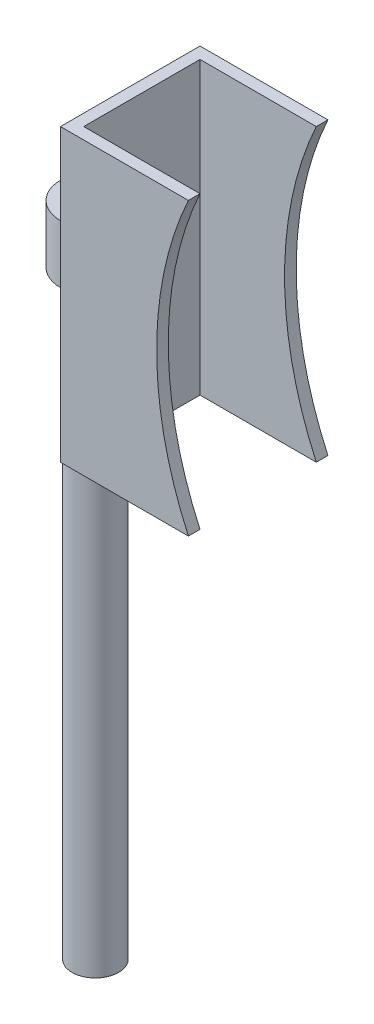
ISO-10303-21;
HEADER;
FILE_DESCRIPTION(('STEP AP214'),'2;1');
FILE_NAME('part.step','',(''),(''),'','','');
FILE_SCHEMA(('AUTOMOTIVE_DESIGN { 1 0 10303 214 1 1 1 1 }'));
ENDSEC;
DATA;
#1=APPLICATION_CONTEXT('core data for automotive mechanical design processes');
#2=APPLICATION_PROTOCOL_DEFINITION('international standard','automotive_design',2000,#1);
#3=PRODUCT_CONTEXT('',#1,'mechanical');
#4=PRODUCT('Part','Part','',(#3));
#5=PRODUCT_RELATED_PRODUCT_CATEGORY('part','',(#4));
#6=PRODUCT_DEFINITION_FORMATION('','',#4);
#7=PRODUCT_DEFINITION_CONTEXT('part definition',#1,'design');
#8=PRODUCT_DEFINITION('design','',#6,#7);
#9=PRODUCT_DEFINITION_SHAPE('','',#8);
#10=(LENGTH_UNIT() NAMED_UNIT(*) SI_UNIT(.MILLI.,.METRE.));
#11=(NAMED_UNIT(*) PLANE_ANGLE_UNIT() SI_UNIT($,.RADIAN.));
#12=(NAMED_UNIT(*) SI_UNIT($,.STERADIAN.) SOLID_ANGLE_UNIT());
#13=UNCERTAINTY_MEASURE_WITH_UNIT(LENGTH_MEASURE(1.E-05),#10,'distance_accuracy_value','');
#14=(GEOMETRIC_REPRESENTATION_CONTEXT(3) GLOBAL_UNCERTAINTY_ASSIGNED_CONTEXT((#13)) GLOBAL_UNIT_ASSIGNED_CONTEXT((#10,
#11,#12)) REPRESENTATION_CONTEXT('',''));
#15=CARTESIAN_POINT('',(0.,0.,0.));
#16=DIRECTION('',(0.,0.,1.));
#17=DIRECTION('',(1.,0.,0.));
#18=AXIS2_PLACEMENT_3D('',#15,#16,#17);
#19=CARTESIAN_POINT('',(-8.,30.,-10.));
#20=DIRECTION('',(0.,1.,0.));
#21=DIRECTION('',(0.,0.,1.));
#22=AXIS2_PLACEMENT_3D('',#19,#20,#21);
#23=PLANE('',#22);
#24=CARTESIAN_POINT('',(-8.,30.,-10.));
#25=DIRECTION('',(0.,1.,0.));
#26=DIRECTION('',(0.,0.,1.));
#27=AXIS2_PLACEMENT_3D('',#24,#25,#26);
#28=CIRCLE('',#27,6.);
#29=CARTESIAN_POINT('',(-8.,30.,-4.));
#30=VERTEX_POINT('',#29);
#31=EDGE_CURVE('E11',#30,#30,#28,.T.);
#32=ORIENTED_EDGE('',*,*,#31,.T.);
#33=EDGE_LOOP('',(#32));
#34=FACE_BOUND('',#33,.T.);
#35=CARTESIAN_POINT('',(-8.,30.,-10.));
#36=DIRECTION('',(0.,1.,0.));
#37=DIRECTION('',(0.,0.,1.));
#38=AXIS2_PLACEMENT_3D('',#35,#36,#37);
#39=CIRCLE('',#38,4.);
#40=CARTESIAN_POINT('',(-8.,30.,-6.));
#41=VERTEX_POINT('',#40);
#42=EDGE_CURVE('E52',#41,#41,#39,.T.);
#43=ORIENTED_EDGE('',*,*,#42,.F.);
#44=EDGE_LOOP('',(#43));
#45=FACE_BOUND('',#44,.T.);
#46=ADVANCED_FACE('F41',(#34,#45),#23,.T.);
#47=CARTESIAN_POINT('',(-8.,20.,-10.));
#48=DIRECTION('',(0.,1.,0.));
#49=DIRECTION('',(0.,0.,1.));
#50=AXIS2_PLACEMENT_3D('',#47,#48,#49);
#51=PLANE('',#50);
#52=CARTESIAN_POINT('',(-8.,20.,-10.));
#53=DIRECTION('',(0.,1.,0.));
#54=DIRECTION('',(0.,0.,1.));
#55=AXIS2_PLACEMENT_3D('',#52,#53,#54);
#56=CIRCLE('',#55,6.);
#57=CARTESIAN_POINT('',(-8.,20.,-4.));
#58=VERTEX_POINT('',#57);
#59=EDGE_CURVE('E45',#58,#58,#56,.T.);
#60=ORIENTED_EDGE('',*,*,#59,.F.);
#61=EDGE_LOOP('',(#60));
#62=FACE_BOUND('',#61,.T.);
#63=CARTESIAN_POINT('',(-8.,20.,-10.));
#64=DIRECTION('',(0.,1.,0.));
#65=DIRECTION('',(0.,0.,1.));
#66=AXIS2_PLACEMENT_3D('',#63,#64,#65);
#67=CIRCLE('',#66,4.);
#68=CARTESIAN_POINT('',(-8.,20.,-6.));
#69=VERTEX_POINT('',#68);
#70=EDGE_CURVE('E56',#69,#69,#67,.F.);
#71=ORIENTED_EDGE('',*,*,#70,.F.);
#72=EDGE_LOOP('',(#71));
#73=FACE_BOUND('',#72,.T.);
#74=ADVANCED_FACE('F75',(#62,#73),#51,.F.);
#75=CARTESIAN_POINT('',(-8.,30.,-10.));
#76=DIRECTION('',(0.,-1.,0.));
#77=DIRECTION('',(0.,0.,-1.));
#78=AXIS2_PLACEMENT_3D('',#75,#76,#77);
#79=CYLINDRICAL_SURFACE('',#78,6.);
#80=ORIENTED_EDGE('',*,*,#31,.F.);
#81=EDGE_LOOP('',(#80));
#82=FACE_BOUND('',#81,.T.);
#83=ORIENTED_EDGE('',*,*,#59,.T.);
#84=EDGE_LOOP('',(#83));
#85=FACE_BOUND('',#84,.T.);
#86=ADVANCED_FACE('F43',(#82,#85),#79,.T.);
#87=CARTESIAN_POINT('',(-8.,-83.,-10.));
#88=DIRECTION('',(0.,-1.,0.));
#89=DIRECTION('',(0.,0.,-1.));
#90=AXIS2_PLACEMENT_3D('',#87,#88,#89);
#91=PLANE('',#90);
#92=CARTESIAN_POINT('',(-8.,-83.,-10.));
#93=DIRECTION('',(0.,-1.,0.));
#94=DIRECTION('',(0.,0.,-1.));
#95=AXIS2_PLACEMENT_3D('',#92,#93,#94);
#96=CIRCLE('',#95,4.);
#97=CARTESIAN_POINT('',(-8.,-83.,-14.));
#98=VERTEX_POINT('',#97);
#99=EDGE_CURVE('E59',#98,#98,#96,.T.);
#100=ORIENTED_EDGE('',*,*,#99,.T.);
#101=EDGE_LOOP('',(#100));
#102=FACE_BOUND('',#101,.T.);
#103=ADVANCED_FACE('F66',(#102),#91,.T.);
#104=CARTESIAN_POINT('',(-8.,-83.,-10.));
#105=DIRECTION('',(0.,1.,0.));
#106=DIRECTION('',(0.,0.,1.));
#107=AXIS2_PLACEMENT_3D('',#104,#105,#106);
#108=CYLINDRICAL_SURFACE('',#107,4.);
#109=ORIENTED_EDGE('',*,*,#99,.F.);
#110=EDGE_LOOP('',(#109));
#111=FACE_BOUND('',#110,.T.);
#112=ORIENTED_EDGE('',*,*,#70,.T.);
#113=EDGE_LOOP('',(#112));
#114=FACE_BOUND('',#113,.T.);
#115=ADVANCED_FACE('F68',(#111,#114),#108,.T.);
#116=ORIENTED_EDGE('',*,*,#42,.T.);
#117=EDGE_LOOP('',(#116));
#118=FACE_BOUND('',#117,.T.);
#119=CARTESIAN_POINT('',(-8.,40.,-10.));
#120=DIRECTION('',(0.,-1.,0.));
#121=DIRECTION('',(0.,0.,-1.));
#122=AXIS2_PLACEMENT_3D('',#119,#120,#121);
#123=CIRCLE('',#122,4.);
#124=CARTESIAN_POINT('',(-8.,40.,-14.));
#125=VERTEX_POINT('',#124);
#126=EDGE_CURVE('E60',#125,#125,#123,.T.);
#127=ORIENTED_EDGE('',*,*,#126,.T.);
#128=EDGE_LOOP('',(#127));
#129=FACE_BOUND('',#128,.T.);
#130=ADVANCED_FACE('F71',(#118,#129),#108,.T.);
#131=CARTESIAN_POINT('',(-8.,40.,-10.));
#132=DIRECTION('',(0.,-1.,0.));
#133=DIRECTION('',(0.,0.,-1.));
#134=AXIS2_PLACEMENT_3D('',#131,#132,#133);
#135=PLANE('',#134);
#136=ORIENTED_EDGE('',*,*,#126,.F.);
#137=EDGE_LOOP('',(#136));
#138=FACE_BOUND('',#137,.T.);
#139=ADVANCED_FACE('F87',(#138),#135,.F.);
#140=CLOSED_SHELL('',(#46,#74,#86,#103,#115,#130,#139));
#141=MANIFOLD_SOLID_BREP('B2',#140);
#142=CARTESIAN_POINT('',(0.,50.,0.));
#143=DIRECTION('',(0.,0.,1.));
#144=DIRECTION('',(1.,0.,0.));
#145=AXIS2_PLACEMENT_3D('',#142,#143,#144);
#146=PLANE('',#145);
#147=DIRECTION('',(-1.,0.,0.));
#148=VECTOR('',#147,1.);
#149=CARTESIAN_POINT('',(0.,50.,0.));
#150=LINE('',#149,#148);
#151=CARTESIAN_POINT('',(20.,50.,0.));
#152=VERTEX_POINT('',#151);
#153=CARTESIAN_POINT('',(0.,50.,0.));
#154=VERTEX_POINT('',#153);
#155=EDGE_CURVE('E250',#152,#154,#150,.T.);
#156=ORIENTED_EDGE('',*,*,#155,.F.);
#157=CARTESIAN_POINT('',(74.5435605731786,25.,0.));
#158=DIRECTION('',(0.,0.,1.));
#159=DIRECTION('',(1.,0.,0.));
#160=AXIS2_PLACEMENT_3D('',#157,#158,#159);
#161=CIRCLE('',#160,60.);
#162=CARTESIAN_POINT('',(20.,0.,0.));
#163=VERTEX_POINT('',#162);
#164=EDGE_CURVE('E215',#152,#163,#161,.T.);
#165=ORIENTED_EDGE('',*,*,#164,.T.);
#166=DIRECTION('',(-1.,0.,0.));
#167=VECTOR('',#166,1.);
#168=CARTESIAN_POINT('',(0.,0.,0.));
#169=LINE('',#168,#167);
#170=CARTESIAN_POINT('',(0.,0.,0.));
#171=VERTEX_POINT('',#170);
#172=EDGE_CURVE('E234',#163,#171,#169,.T.);
#173=ORIENTED_EDGE('',*,*,#172,.T.);
#174=DIRECTION('',(0.,-1.,0.));
#175=VECTOR('',#174,1.);
#176=CARTESIAN_POINT('',(0.,50.,0.));
#177=LINE('',#176,#175);
#178=EDGE_CURVE('E39',#154,#171,#177,.T.);
#179=ORIENTED_EDGE('',*,*,#178,.F.);
#180=EDGE_LOOP('',(#156,#165,#173,#179));
#181=FACE_BOUND('',#180,.T.);
#182=ADVANCED_FACE('F140',(#181),#146,.F.);
#183=CARTESIAN_POINT('',(0.,50.,0.));
#184=DIRECTION('',(-1.,0.,0.));
#185=DIRECTION('',(0.,0.,1.));
#186=AXIS2_PLACEMENT_3D('',#183,#184,#185);
#187=PLANE('',#186);
#188=DIRECTION('',(0.,0.,-1.));
#189=VECTOR('',#188,1.);
#190=CARTESIAN_POINT('',(0.,0.,0.));
#191=LINE('',#190,#189);
#192=CARTESIAN_POINT('',(0.,0.,-20.));
#193=VERTEX_POINT('',#192);
#194=EDGE_CURVE('E237',#171,#193,#191,.T.);
#195=ORIENTED_EDGE('',*,*,#194,.T.);
#196=DIRECTION('',(0.,-1.,0.));
#197=VECTOR('',#196,1.);
#198=CARTESIAN_POINT('',(0.,50.,-20.));
#199=LINE('',#198,#197);
#200=CARTESIAN_POINT('',(0.,50.,-20.));
#201=VERTEX_POINT('',#200);
#202=EDGE_CURVE('E148',#201,#193,#199,.T.);
#203=ORIENTED_EDGE('',*,*,#202,.F.);
#204=DIRECTION('',(0.,0.,-1.));
#205=VECTOR('',#204,1.);
#206=CARTESIAN_POINT('',(0.,50.,0.));
#207=LINE('',#206,#205);
#208=EDGE_CURVE('E194',#154,#201,#207,.T.);
#209=ORIENTED_EDGE('',*,*,#208,.F.);
#210=ORIENTED_EDGE('',*,*,#178,.T.);
#211=EDGE_LOOP('',(#195,#203,#209,#210));
#212=FACE_BOUND('',#211,.T.);
#213=ADVANCED_FACE('F286',(#212),#187,.F.);
#214=CARTESIAN_POINT('',(0.,50.,-20.));
#215=DIRECTION('',(0.,0.,-1.));
#216=DIRECTION('',(-1.,0.,0.));
#217=AXIS2_PLACEMENT_3D('',#214,#215,#216);
#218=PLANE('',#217);
#219=DIRECTION('',(1.,0.,0.));
#220=VECTOR('',#219,1.);
#221=CARTESIAN_POINT('',(0.,0.,-20.));
#222=LINE('',#221,#220);
#223=CARTESIAN_POINT('',(20.,0.,-20.));
#224=VERTEX_POINT('',#223);
#225=EDGE_CURVE('E239',#193,#224,#222,.T.);
#226=ORIENTED_EDGE('',*,*,#225,.T.);
#227=CARTESIAN_POINT('',(74.5435605731786,25.,-20.));
#228=DIRECTION('',(0.,0.,-1.));
#229=DIRECTION('',(-1.,0.,0.));
#230=AXIS2_PLACEMENT_3D('',#227,#228,#229);
#231=CIRCLE('',#230,60.);
#232=CARTESIAN_POINT('',(20.,50.,-20.));
#233=VERTEX_POINT('',#232);
#234=EDGE_CURVE('E270',#224,#233,#231,.T.);
#235=ORIENTED_EDGE('',*,*,#234,.T.);
#236=DIRECTION('',(1.,0.,0.));
#237=VECTOR('',#236,1.);
#238=CARTESIAN_POINT('',(0.,50.,-20.));
#239=LINE('',#238,#237);
#240=EDGE_CURVE('E261',#201,#233,#239,.T.);
#241=ORIENTED_EDGE('',*,*,#240,.F.);
#242=ORIENTED_EDGE('',*,*,#202,.T.);
#243=EDGE_LOOP('',(#226,#235,#241,#242));
#244=FACE_BOUND('',#243,.T.);
#245=ADVANCED_FACE('F257',(#244),#218,.F.);
#246=CARTESIAN_POINT('',(-2.,50.,-22.));
#247=DIRECTION('',(0.,0.,1.));
#248=DIRECTION('',(1.,0.,0.));
#249=AXIS2_PLACEMENT_3D('',#246,#247,#248);
#250=PLANE('',#249);
#251=DIRECTION('',(-1.,0.,0.));
#252=VECTOR('',#251,1.);
#253=CARTESIAN_POINT('',(-2.,50.,-22.));
#254=LINE('',#253,#252);
#255=CARTESIAN_POINT('',(20.,50.,-22.));
#256=VERTEX_POINT('',#255);
#257=CARTESIAN_POINT('',(-2.,50.,-22.));
#258=VERTEX_POINT('',#257);
#259=EDGE_CURVE('E230',#256,#258,#254,.T.);
#260=ORIENTED_EDGE('',*,*,#259,.F.);
#261=CARTESIAN_POINT('',(74.5435605731786,25.,-22.));
#262=DIRECTION('',(0.,0.,1.));
#263=DIRECTION('',(1.,0.,0.));
#264=AXIS2_PLACEMENT_3D('',#261,#262,#263);
#265=CIRCLE('',#264,60.);
#266=CARTESIAN_POINT('',(20.,0.,-22.));
#267=VERTEX_POINT('',#266);
#268=EDGE_CURVE('E226',#256,#267,#265,.T.);
#269=ORIENTED_EDGE('',*,*,#268,.T.);
#270=DIRECTION('',(-1.,0.,0.));
#271=VECTOR('',#270,1.);
#272=CARTESIAN_POINT('',(-2.,0.,-22.));
#273=LINE('',#272,#271);
#274=CARTESIAN_POINT('',(-2.,0.,-22.));
#275=VERTEX_POINT('',#274);
#276=EDGE_CURVE('E244',#267,#275,#273,.T.);
#277=ORIENTED_EDGE('',*,*,#276,.T.);
#278=DIRECTION('',(0.,-1.,0.));
#279=VECTOR('',#278,1.);
#280=CARTESIAN_POINT('',(-2.,50.,-22.));
#281=LINE('',#280,#279);
#282=EDGE_CURVE('E252',#258,#275,#281,.T.);
#283=ORIENTED_EDGE('',*,*,#282,.F.);
#284=EDGE_LOOP('',(#260,#269,#277,#283));
#285=FACE_BOUND('',#284,.T.);
#286=ADVANCED_FACE('F273',(#285),#250,.F.);
#287=CARTESIAN_POINT('',(-2.,50.,2.));
#288=DIRECTION('',(1.,0.,0.));
#289=DIRECTION('',(0.,0.,-1.));
#290=AXIS2_PLACEMENT_3D('',#287,#288,#289);
#291=PLANE('',#290);
#292=DIRECTION('',(0.,0.,1.));
#293=VECTOR('',#292,1.);
#294=CARTESIAN_POINT('',(-2.,0.,2.));
#295=LINE('',#294,#293);
#296=CARTESIAN_POINT('',(-2.,0.,2.));
#297=VERTEX_POINT('',#296);
#298=EDGE_CURVE('E179',#275,#297,#295,.T.);
#299=ORIENTED_EDGE('',*,*,#298,.T.);
#300=DIRECTION('',(0.,-1.,0.));
#301=VECTOR('',#300,1.);
#302=CARTESIAN_POINT('',(-2.,50.,2.));
#303=LINE('',#302,#301);
#304=CARTESIAN_POINT('',(-2.,50.,2.));
#305=VERTEX_POINT('',#304);
#306=EDGE_CURVE('E217',#305,#297,#303,.T.);
#307=ORIENTED_EDGE('',*,*,#306,.F.);
#308=DIRECTION('',(0.,0.,1.));
#309=VECTOR('',#308,1.);
#310=CARTESIAN_POINT('',(-2.,50.,2.));
#311=LINE('',#310,#309);
#312=EDGE_CURVE('E156',#258,#305,#311,.T.);
#313=ORIENTED_EDGE('',*,*,#312,.F.);
#314=ORIENTED_EDGE('',*,*,#282,.T.);
#315=EDGE_LOOP('',(#299,#307,#313,#314));
#316=FACE_BOUND('',#315,.T.);
#317=ADVANCED_FACE('F283',(#316),#291,.F.);
#318=CARTESIAN_POINT('',(-2.,50.,2.));
#319=DIRECTION('',(0.,0.,-1.));
#320=DIRECTION('',(-1.,0.,0.));
#321=AXIS2_PLACEMENT_3D('',#318,#319,#320);
#322=PLANE('',#321);
#323=DIRECTION('',(1.,0.,0.));
#324=VECTOR('',#323,1.);
#325=CARTESIAN_POINT('',(-2.,0.,2.));
#326=LINE('',#325,#324);
#327=CARTESIAN_POINT('',(20.,0.,2.));
#328=VERTEX_POINT('',#327);
#329=EDGE_CURVE('E224',#297,#328,#326,.T.);
#330=ORIENTED_EDGE('',*,*,#329,.T.);
#331=CARTESIAN_POINT('',(74.5435605731786,25.,2.));
#332=DIRECTION('',(0.,0.,-1.));
#333=DIRECTION('',(-1.,0.,0.));
#334=AXIS2_PLACEMENT_3D('',#331,#332,#333);
#335=CIRCLE('',#334,60.);
#336=CARTESIAN_POINT('',(20.,50.,2.));
#337=VERTEX_POINT('',#336);
#338=EDGE_CURVE('E187',#328,#337,#335,.T.);
#339=ORIENTED_EDGE('',*,*,#338,.T.);
#340=DIRECTION('',(1.,0.,0.));
#341=VECTOR('',#340,1.);
#342=CARTESIAN_POINT('',(-2.,50.,2.));
#343=LINE('',#342,#341);
#344=EDGE_CURVE('E218',#305,#337,#343,.T.);
#345=ORIENTED_EDGE('',*,*,#344,.F.);
#346=ORIENTED_EDGE('',*,*,#306,.T.);
#347=EDGE_LOOP('',(#330,#339,#345,#346));
#348=FACE_BOUND('',#347,.T.);
#349=ADVANCED_FACE('F222',(#348),#322,.F.);
#350=CARTESIAN_POINT('',(0.,50.,0.));
#351=DIRECTION('',(0.,-1.,0.));
#352=DIRECTION('',(0.,0.,-1.));
#353=AXIS2_PLACEMENT_3D('',#350,#351,#352);
#354=PLANE('',#353);
#355=ORIENTED_EDGE('',*,*,#155,.T.);
#356=ORIENTED_EDGE('',*,*,#208,.T.);
#357=ORIENTED_EDGE('',*,*,#240,.T.);
#358=DIRECTION('',(0.,0.,-1.));
#359=VECTOR('',#358,1.);
#360=CARTESIAN_POINT('',(20.,50.,-20.));
#361=LINE('',#360,#359);
#362=EDGE_CURVE('E282',#233,#256,#361,.T.);
#363=ORIENTED_EDGE('',*,*,#362,.T.);
#364=ORIENTED_EDGE('',*,*,#259,.T.);
#365=ORIENTED_EDGE('',*,*,#312,.T.);
#366=ORIENTED_EDGE('',*,*,#344,.T.);
#367=DIRECTION('',(0.,0.,-1.));
#368=VECTOR('',#367,1.);
#369=CARTESIAN_POINT('',(20.,50.,0.));
#370=LINE('',#369,#368);
#371=EDGE_CURVE('E212',#337,#152,#370,.T.);
#372=ORIENTED_EDGE('',*,*,#371,.T.);
#373=EDGE_LOOP('',(#355,#356,#357,#363,#364,#365,#366,#372));
#374=FACE_BOUND('',#373,.T.);
#375=ADVANCED_FACE('F228',(#374),#354,.F.);
#376=CARTESIAN_POINT('',(0.,0.,0.));
#377=DIRECTION('',(0.,-1.,0.));
#378=DIRECTION('',(0.,0.,-1.));
#379=AXIS2_PLACEMENT_3D('',#376,#377,#378);
#380=PLANE('',#379);
#381=ORIENTED_EDGE('',*,*,#172,.F.);
#382=DIRECTION('',(0.,0.,-1.));
#383=VECTOR('',#382,1.);
#384=CARTESIAN_POINT('',(20.,0.,0.));
#385=LINE('',#384,#383);
#386=EDGE_CURVE('E248',#328,#163,#385,.T.);
#387=ORIENTED_EDGE('',*,*,#386,.F.);
#388=ORIENTED_EDGE('',*,*,#329,.F.);
#389=ORIENTED_EDGE('',*,*,#298,.F.);
#390=ORIENTED_EDGE('',*,*,#276,.F.);
#391=DIRECTION('',(0.,0.,-1.));
#392=VECTOR('',#391,1.);
#393=CARTESIAN_POINT('',(20.,0.,-20.));
#394=LINE('',#393,#392);
#395=EDGE_CURVE('E242',#224,#267,#394,.T.);
#396=ORIENTED_EDGE('',*,*,#395,.F.);
#397=ORIENTED_EDGE('',*,*,#225,.F.);
#398=ORIENTED_EDGE('',*,*,#194,.F.);
#399=EDGE_LOOP('',(#381,#387,#388,#389,#390,#396,#397,#398));
#400=FACE_BOUND('',#399,.T.);
#401=ADVANCED_FACE('F264',(#400),#380,.T.);
#402=CARTESIAN_POINT('',(74.5435605731786,25.,2.));
#403=DIRECTION('',(0.,0.,-1.));
#404=DIRECTION('',(-1.,0.,0.));
#405=AXIS2_PLACEMENT_3D('',#402,#403,#404);
#406=CYLINDRICAL_SURFACE('',#405,60.);
#407=ORIENTED_EDGE('',*,*,#395,.T.);
#408=ORIENTED_EDGE('',*,*,#268,.F.);
#409=ORIENTED_EDGE('',*,*,#362,.F.);
#410=ORIENTED_EDGE('',*,*,#234,.F.);
#411=EDGE_LOOP('',(#407,#408,#409,#410));
#412=FACE_BOUND('',#411,.T.);
#413=ADVANCED_FACE('F268',(#412),#406,.F.);
#414=ORIENTED_EDGE('',*,*,#338,.F.);
#415=ORIENTED_EDGE('',*,*,#386,.T.);
#416=ORIENTED_EDGE('',*,*,#164,.F.);
#417=ORIENTED_EDGE('',*,*,#371,.F.);
#418=EDGE_LOOP('',(#414,#415,#416,#417));
#419=FACE_BOUND('',#418,.T.);
#420=ADVANCED_FACE('F213',(#419),#406,.F.);
#421=CLOSED_SHELL('',(#182,#213,#245,#286,#317,#349,#375,#401,#413,#420));
#422=MANIFOLD_SOLID_BREP('B6',#421);
#423=ADVANCED_BREP_SHAPE_REPRESENTATION('',(#18,#141,#422),#14);
#424=SHAPE_DEFINITION_REPRESENTATION(#9,#423);
ENDSEC;
END-ISO-10303-21;
